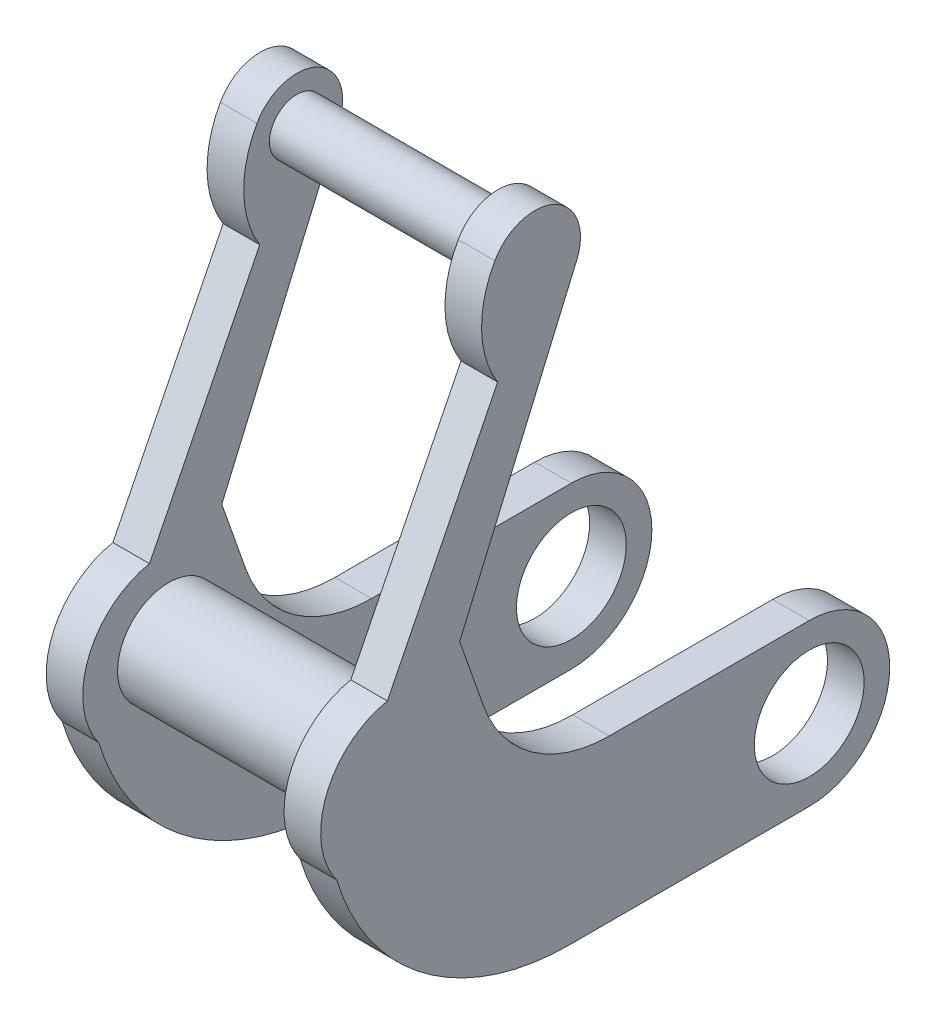
ISO-10303-21;
HEADER;
FILE_DESCRIPTION(('STEP AP214'),'2;1');
FILE_NAME('part.step','',(''),(''),'','','');
FILE_SCHEMA(('AUTOMOTIVE_DESIGN { 1 0 10303 214 1 1 1 1 }'));
ENDSEC;
DATA;
#1=APPLICATION_CONTEXT('core data for automotive mechanical design processes');
#2=APPLICATION_PROTOCOL_DEFINITION('international standard','automotive_design',2000,#1);
#3=PRODUCT_CONTEXT('',#1,'mechanical');
#4=PRODUCT('Part','Part','',(#3));
#5=PRODUCT_RELATED_PRODUCT_CATEGORY('part','',(#4));
#6=PRODUCT_DEFINITION_FORMATION('','',#4);
#7=PRODUCT_DEFINITION_CONTEXT('part definition',#1,'design');
#8=PRODUCT_DEFINITION('design','',#6,#7);
#9=PRODUCT_DEFINITION_SHAPE('','',#8);
#10=(LENGTH_UNIT() NAMED_UNIT(*) SI_UNIT(.MILLI.,.METRE.));
#11=(NAMED_UNIT(*) PLANE_ANGLE_UNIT() SI_UNIT($,.RADIAN.));
#12=(NAMED_UNIT(*) SI_UNIT($,.STERADIAN.) SOLID_ANGLE_UNIT());
#13=UNCERTAINTY_MEASURE_WITH_UNIT(LENGTH_MEASURE(1.E-05),#10,'distance_accuracy_value','');
#14=(GEOMETRIC_REPRESENTATION_CONTEXT(3) GLOBAL_UNCERTAINTY_ASSIGNED_CONTEXT((#13)) GLOBAL_UNIT_ASSIGNED_CONTEXT((#10,
#11,#12)) REPRESENTATION_CONTEXT('',''));
#15=CARTESIAN_POINT('',(0.,0.,0.));
#16=DIRECTION('',(0.,0.,1.));
#17=DIRECTION('',(1.,0.,0.));
#18=AXIS2_PLACEMENT_3D('',#15,#16,#17);
#19=CARTESIAN_POINT('',(20.,0.,0.));
#20=DIRECTION('',(1.,0.,0.));
#21=DIRECTION('',(0.,0.,-1.));
#22=AXIS2_PLACEMENT_3D('',#19,#20,#21);
#23=PLANE('',#22);
#24=CARTESIAN_POINT('',(20.,0.,0.));
#25=DIRECTION('',(1.,0.,0.));
#26=DIRECTION('',(0.,0.,-1.));
#27=AXIS2_PLACEMENT_3D('',#24,#25,#26);
#28=CIRCLE('',#27,44.);
#29=CARTESIAN_POINT('',(20.,-44.,0.));
#30=VERTEX_POINT('',#29);
#31=CARTESIAN_POINT('',(20.,44.,0.));
#32=VERTEX_POINT('',#31);
#33=EDGE_CURVE('E173',#30,#32,#28,.T.);
#34=ORIENTED_EDGE('',*,*,#33,.T.);
#35=DIRECTION('',(0.,0.,1.));
#36=VECTOR('',#35,1.);
#37=CARTESIAN_POINT('',(20.,44.,0.));
#38=LINE('',#37,#36);
#39=CARTESIAN_POINT('',(20.,44.,109.215135043859));
#40=VERTEX_POINT('',#39);
#41=EDGE_CURVE('E103',#32,#40,#38,.T.);
#42=ORIENTED_EDGE('',*,*,#41,.T.);
#43=CARTESIAN_POINT('',(20.,117.,109.215135043859));
#44=DIRECTION('',(-1.,0.,0.));
#45=DIRECTION('',(0.,0.,-1.));
#46=AXIS2_PLACEMENT_3D('',#43,#44,#45);
#47=CIRCLE('',#46,73.0000000000001);
#48=CARTESIAN_POINT('',(20.,92.7522373724899,178.070389074034));
#49=VERTEX_POINT('',#48);
#50=EDGE_CURVE('E333',#40,#49,#47,.T.);
#51=ORIENTED_EDGE('',*,*,#50,.T.);
#52=DIRECTION('',(0.,0.943222657947602,0.332161131883701));
#53=VECTOR('',#52,1.);
#54=CARTESIAN_POINT('',(20.,92.7522373724899,178.070389074034));
#55=LINE('',#54,#53);
#56=CARTESIAN_POINT('',(20.,129.537921032446,191.024673217498));
#57=VERTEX_POINT('',#56);
#58=EDGE_CURVE('E335',#49,#57,#55,.T.);
#59=ORIENTED_EDGE('',*,*,#58,.T.);
#60=DIRECTION('',(0.,0.918446381343086,-0.395545502562969));
#61=VECTOR('',#60,1.);
#62=CARTESIAN_POINT('',(20.,129.537921032446,191.024673217498));
#63=LINE('',#62,#61);
#64=CARTESIAN_POINT('',(20.,278.111362435926,127.038840466423));
#65=VERTEX_POINT('',#64);
#66=EDGE_CURVE('E337',#57,#65,#63,.T.);
#67=ORIENTED_EDGE('',*,*,#66,.T.);
#68=CARTESIAN_POINT('',(20.,288.,150.));
#69=DIRECTION('',(1.,0.,0.));
#70=DIRECTION('',(0.,0.,-1.));
#71=AXIS2_PLACEMENT_3D('',#68,#69,#70);
#72=CIRCLE('',#71,24.9999999999999);
#73=CARTESIAN_POINT('',(20.,300.199413834294,171.821418425474));
#74=VERTEX_POINT('',#73);
#75=EDGE_CURVE('E339',#65,#74,#72,.T.);
#76=ORIENTED_EDGE('',*,*,#75,.T.);
#77=CARTESIAN_POINT('',(20.,272.384750292103,122.068584415393));
#78=DIRECTION('',(1.,0.,0.));
#79=DIRECTION('',(0.,0.,-1.));
#80=AXIS2_PLACEMENT_3D('',#77,#78,#79);
#81=CIRCLE('',#80,57.);
#82=CARTESIAN_POINT('',(20.,242.,170.294790462381));
#83=VERTEX_POINT('',#82);
#84=EDGE_CURVE('E341',#74,#83,#81,.T.);
#85=ORIENTED_EDGE('',*,*,#84,.T.);
#86=DIRECTION('',(0.,-0.894934361602023,0.446197813109813));
#87=VECTOR('',#86,1.);
#88=CARTESIAN_POINT('',(20.,121.183861183727,230.531495232206));
#89=LINE('',#88,#87);
#90=CARTESIAN_POINT('',(20.,121.183861183727,230.531495232206));
#91=VERTEX_POINT('',#90);
#92=EDGE_CURVE('E134',#83,#91,#89,.T.);
#93=ORIENTED_EDGE('',*,*,#92,.T.);
#94=CARTESIAN_POINT('',(20.,77.,222.));
#95=DIRECTION('',(1.,0.,0.));
#96=DIRECTION('',(0.,0.,-1.));
#97=AXIS2_PLACEMENT_3D('',#94,#95,#96);
#98=CIRCLE('',#97,45.);
#99=CARTESIAN_POINT('',(20.,50.3509597877907,258.260566125863));
#100=VERTEX_POINT('',#99);
#101=EDGE_CURVE('E128',#91,#100,#98,.T.);
#102=ORIENTED_EDGE('',*,*,#101,.T.);
#103=CARTESIAN_POINT('',(20.,89.,131.));
#104=DIRECTION('',(1.,0.,0.));
#105=DIRECTION('',(0.,0.,-1.));
#106=AXIS2_PLACEMENT_3D('',#103,#104,#105);
#107=CIRCLE('',#106,133.);
#108=CARTESIAN_POINT('',(20.,-44.,131.));
#109=VERTEX_POINT('',#108);
#110=EDGE_CURVE('E132',#100,#109,#107,.T.);
#111=ORIENTED_EDGE('',*,*,#110,.T.);
#112=DIRECTION('',(0.,0.,-1.));
#113=VECTOR('',#112,1.);
#114=CARTESIAN_POINT('',(20.,-44.,0.));
#115=LINE('',#114,#113);
#116=EDGE_CURVE('E49',#109,#30,#115,.T.);
#117=ORIENTED_EDGE('',*,*,#116,.T.);
#118=EDGE_LOOP('',(#34,#42,#51,#59,#67,#76,#85,#93,#102,#111,#117));
#119=FACE_BOUND('',#118,.T.);
#120=CARTESIAN_POINT('',(20.,0.,0.));
#121=DIRECTION('',(1.,0.,0.));
#122=DIRECTION('',(0.,0.,-1.));
#123=AXIS2_PLACEMENT_3D('',#120,#121,#122);
#124=CIRCLE('',#123,30.);
#125=CARTESIAN_POINT('',(20.,0.,-30.));
#126=VERTEX_POINT('',#125);
#127=EDGE_CURVE('E156',#126,#126,#124,.T.);
#128=ORIENTED_EDGE('',*,*,#127,.F.);
#129=EDGE_LOOP('',(#128));
#130=FACE_BOUND('',#129,.T.);
#131=ADVANCED_FACE('F32',(#119,#130),#23,.T.);
#132=CARTESIAN_POINT('',(0.,0.,0.));
#133=DIRECTION('',(1.,0.,0.));
#134=DIRECTION('',(0.,0.,-1.));
#135=AXIS2_PLACEMENT_3D('',#132,#133,#134);
#136=PLANE('',#135);
#137=CARTESIAN_POINT('',(0.,79.,220.));
#138=DIRECTION('',(1.,0.,0.));
#139=DIRECTION('',(0.,0.,-1.));
#140=AXIS2_PLACEMENT_3D('',#137,#138,#139);
#141=CIRCLE('',#140,28.);
#142=CARTESIAN_POINT('',(0.,79.,192.));
#143=VERTEX_POINT('',#142);
#144=EDGE_CURVE('E11',#143,#143,#141,.F.);
#145=ORIENTED_EDGE('',*,*,#144,.F.);
#146=EDGE_LOOP('',(#145));
#147=FACE_BOUND('',#146,.T.);
#148=CARTESIAN_POINT('',(0.,288.,150.));
#149=DIRECTION('',(1.,0.,0.));
#150=DIRECTION('',(0.,0.,-1.));
#151=AXIS2_PLACEMENT_3D('',#148,#149,#150);
#152=CIRCLE('',#151,15.);
#153=CARTESIAN_POINT('',(0.,288.,135.));
#154=VERTEX_POINT('',#153);
#155=EDGE_CURVE('E197',#154,#154,#152,.F.);
#156=ORIENTED_EDGE('',*,*,#155,.F.);
#157=EDGE_LOOP('',(#156));
#158=FACE_BOUND('',#157,.T.);
#159=CARTESIAN_POINT('',(0.,0.,0.));
#160=DIRECTION('',(1.,0.,0.));
#161=DIRECTION('',(0.,0.,-1.));
#162=AXIS2_PLACEMENT_3D('',#159,#160,#161);
#163=CIRCLE('',#162,44.);
#164=CARTESIAN_POINT('',(0.,-44.,0.));
#165=VERTEX_POINT('',#164);
#166=CARTESIAN_POINT('',(0.,44.,0.));
#167=VERTEX_POINT('',#166);
#168=EDGE_CURVE('E152',#165,#167,#163,.T.);
#169=ORIENTED_EDGE('',*,*,#168,.F.);
#170=DIRECTION('',(0.,0.,-1.));
#171=VECTOR('',#170,1.);
#172=CARTESIAN_POINT('',(0.,-44.,0.));
#173=LINE('',#172,#171);
#174=CARTESIAN_POINT('',(0.,-44.,131.));
#175=VERTEX_POINT('',#174);
#176=EDGE_CURVE('E94',#175,#165,#173,.T.);
#177=ORIENTED_EDGE('',*,*,#176,.F.);
#178=CARTESIAN_POINT('',(0.,89.,131.));
#179=DIRECTION('',(1.,0.,0.));
#180=DIRECTION('',(0.,0.,-1.));
#181=AXIS2_PLACEMENT_3D('',#178,#179,#180);
#182=CIRCLE('',#181,133.);
#183=CARTESIAN_POINT('',(0.,50.3509597877907,258.260566125863));
#184=VERTEX_POINT('',#183);
#185=EDGE_CURVE('E88',#184,#175,#182,.T.);
#186=ORIENTED_EDGE('',*,*,#185,.F.);
#187=CARTESIAN_POINT('',(0.,77.,222.));
#188=DIRECTION('',(1.,0.,0.));
#189=DIRECTION('',(0.,0.,-1.));
#190=AXIS2_PLACEMENT_3D('',#187,#188,#189);
#191=CIRCLE('',#190,45.);
#192=CARTESIAN_POINT('',(0.,121.183861183727,230.531495232206));
#193=VERTEX_POINT('',#192);
#194=EDGE_CURVE('E142',#193,#184,#191,.T.);
#195=ORIENTED_EDGE('',*,*,#194,.F.);
#196=DIRECTION('',(0.,-0.894934361602023,0.446197813109813));
#197=VECTOR('',#196,1.);
#198=CARTESIAN_POINT('',(0.,121.183861183727,230.531495232206));
#199=LINE('',#198,#197);
#200=CARTESIAN_POINT('',(0.,242.,170.294790462381));
#201=VERTEX_POINT('',#200);
#202=EDGE_CURVE('E168',#201,#193,#199,.T.);
#203=ORIENTED_EDGE('',*,*,#202,.F.);
#204=CARTESIAN_POINT('',(0.,272.384750292103,122.068584415393));
#205=DIRECTION('',(1.,0.,0.));
#206=DIRECTION('',(0.,0.,-1.));
#207=AXIS2_PLACEMENT_3D('',#204,#205,#206);
#208=CIRCLE('',#207,57.);
#209=CARTESIAN_POINT('',(0.,300.199413834294,171.821418425474));
#210=VERTEX_POINT('',#209);
#211=EDGE_CURVE('E166',#210,#201,#208,.T.);
#212=ORIENTED_EDGE('',*,*,#211,.F.);
#213=CARTESIAN_POINT('',(0.,288.,150.));
#214=DIRECTION('',(1.,0.,0.));
#215=DIRECTION('',(0.,0.,-1.));
#216=AXIS2_PLACEMENT_3D('',#213,#214,#215);
#217=CIRCLE('',#216,24.9999999999999);
#218=CARTESIAN_POINT('',(0.,278.111362435926,127.038840466423));
#219=VERTEX_POINT('',#218);
#220=EDGE_CURVE('E164',#219,#210,#217,.T.);
#221=ORIENTED_EDGE('',*,*,#220,.F.);
#222=DIRECTION('',(0.,0.918446381343086,-0.395545502562969));
#223=VECTOR('',#222,1.);
#224=CARTESIAN_POINT('',(0.,129.537921032446,191.024673217498));
#225=LINE('',#224,#223);
#226=CARTESIAN_POINT('',(0.,129.537921032446,191.024673217498));
#227=VERTEX_POINT('',#226);
#228=EDGE_CURVE('E162',#227,#219,#225,.T.);
#229=ORIENTED_EDGE('',*,*,#228,.F.);
#230=DIRECTION('',(0.,0.943222657947602,0.332161131883701));
#231=VECTOR('',#230,1.);
#232=CARTESIAN_POINT('',(0.,92.7522373724899,178.070389074034));
#233=LINE('',#232,#231);
#234=CARTESIAN_POINT('',(0.,92.7522373724899,178.070389074034));
#235=VERTEX_POINT('',#234);
#236=EDGE_CURVE('E160',#235,#227,#233,.T.);
#237=ORIENTED_EDGE('',*,*,#236,.F.);
#238=CARTESIAN_POINT('',(0.,117.,109.215135043859));
#239=DIRECTION('',(-1.,0.,0.));
#240=DIRECTION('',(0.,0.,-1.));
#241=AXIS2_PLACEMENT_3D('',#238,#239,#240);
#242=CIRCLE('',#241,73.0000000000001);
#243=CARTESIAN_POINT('',(0.,44.,109.215135043859));
#244=VERTEX_POINT('',#243);
#245=EDGE_CURVE('E158',#244,#235,#242,.T.);
#246=ORIENTED_EDGE('',*,*,#245,.F.);
#247=DIRECTION('',(0.,0.,1.));
#248=VECTOR('',#247,1.);
#249=CARTESIAN_POINT('',(0.,44.,0.));
#250=LINE('',#249,#248);
#251=EDGE_CURVE('E155',#167,#244,#250,.T.);
#252=ORIENTED_EDGE('',*,*,#251,.F.);
#253=EDGE_LOOP('',(#169,#177,#186,#195,#203,#212,#221,#229,#237,#246,#252));
#254=FACE_BOUND('',#253,.T.);
#255=CARTESIAN_POINT('',(0.,0.,0.));
#256=DIRECTION('',(1.,0.,0.));
#257=DIRECTION('',(0.,0.,-1.));
#258=AXIS2_PLACEMENT_3D('',#255,#256,#257);
#259=CIRCLE('',#258,30.);
#260=CARTESIAN_POINT('',(0.,0.,-30.));
#261=VERTEX_POINT('',#260);
#262=EDGE_CURVE('E326',#261,#261,#259,.T.);
#263=ORIENTED_EDGE('',*,*,#262,.T.);
#264=EDGE_LOOP('',(#263));
#265=FACE_BOUND('',#264,.T.);
#266=ADVANCED_FACE('F354',(#147,#158,#254,#265),#136,.F.);
#267=CARTESIAN_POINT('',(20.,0.,0.));
#268=DIRECTION('',(-1.,0.,0.));
#269=DIRECTION('',(0.,0.,1.));
#270=AXIS2_PLACEMENT_3D('',#267,#268,#269);
#271=CYLINDRICAL_SURFACE('',#270,44.);
#272=ORIENTED_EDGE('',*,*,#168,.T.);
#273=DIRECTION('',(-1.,0.,0.));
#274=VECTOR('',#273,1.);
#275=CARTESIAN_POINT('',(20.,44.,0.));
#276=LINE('',#275,#274);
#277=EDGE_CURVE('E195',#32,#167,#276,.T.);
#278=ORIENTED_EDGE('',*,*,#277,.F.);
#279=ORIENTED_EDGE('',*,*,#33,.F.);
#280=DIRECTION('',(-1.,0.,0.));
#281=VECTOR('',#280,1.);
#282=CARTESIAN_POINT('',(20.,-44.,0.));
#283=LINE('',#282,#281);
#284=EDGE_CURVE('E148',#30,#165,#283,.T.);
#285=ORIENTED_EDGE('',*,*,#284,.T.);
#286=EDGE_LOOP('',(#272,#278,#279,#285));
#287=FACE_BOUND('',#286,.T.);
#288=ADVANCED_FACE('F34',(#287),#271,.T.);
#289=CARTESIAN_POINT('',(20.,44.,0.));
#290=DIRECTION('',(0.,-1.,0.));
#291=DIRECTION('',(0.,0.,-1.));
#292=AXIS2_PLACEMENT_3D('',#289,#290,#291);
#293=PLANE('',#292);
#294=ORIENTED_EDGE('',*,*,#251,.T.);
#295=DIRECTION('',(-1.,0.,0.));
#296=VECTOR('',#295,1.);
#297=CARTESIAN_POINT('',(20.,44.,109.215135043859));
#298=LINE('',#297,#296);
#299=EDGE_CURVE('E192',#40,#244,#298,.T.);
#300=ORIENTED_EDGE('',*,*,#299,.F.);
#301=ORIENTED_EDGE('',*,*,#41,.F.);
#302=ORIENTED_EDGE('',*,*,#277,.T.);
#303=EDGE_LOOP('',(#294,#300,#301,#302));
#304=FACE_BOUND('',#303,.T.);
#305=ADVANCED_FACE('F580',(#304),#293,.F.);
#306=CARTESIAN_POINT('',(20.,117.,109.215135043859));
#307=DIRECTION('',(-1.,0.,0.));
#308=DIRECTION('',(0.,0.,1.));
#309=AXIS2_PLACEMENT_3D('',#306,#307,#308);
#310=CYLINDRICAL_SURFACE('',#309,73.0000000000001);
#311=ORIENTED_EDGE('',*,*,#245,.T.);
#312=DIRECTION('',(-1.,0.,0.));
#313=VECTOR('',#312,1.);
#314=CARTESIAN_POINT('',(20.,92.7522373724899,178.070389074034));
#315=LINE('',#314,#313);
#316=EDGE_CURVE('E189',#49,#235,#315,.T.);
#317=ORIENTED_EDGE('',*,*,#316,.F.);
#318=ORIENTED_EDGE('',*,*,#50,.F.);
#319=ORIENTED_EDGE('',*,*,#299,.T.);
#320=EDGE_LOOP('',(#311,#317,#318,#319));
#321=FACE_BOUND('',#320,.T.);
#322=ADVANCED_FACE('F570',(#321),#310,.F.);
#323=CARTESIAN_POINT('',(20.,92.7522373724899,178.070389074034));
#324=DIRECTION('',(0.,-0.332161131883701,0.943222657947602));
#325=DIRECTION('',(0.,-0.943222657947602,-0.332161131883701));
#326=AXIS2_PLACEMENT_3D('',#323,#324,#325);
#327=PLANE('',#326);
#328=ORIENTED_EDGE('',*,*,#236,.T.);
#329=DIRECTION('',(-1.,0.,0.));
#330=VECTOR('',#329,1.);
#331=CARTESIAN_POINT('',(20.,129.537921032446,191.024673217498));
#332=LINE('',#331,#330);
#333=EDGE_CURVE('E186',#57,#227,#332,.T.);
#334=ORIENTED_EDGE('',*,*,#333,.F.);
#335=ORIENTED_EDGE('',*,*,#58,.F.);
#336=ORIENTED_EDGE('',*,*,#316,.T.);
#337=EDGE_LOOP('',(#328,#334,#335,#336));
#338=FACE_BOUND('',#337,.T.);
#339=ADVANCED_FACE('F560',(#338),#327,.F.);
#340=CARTESIAN_POINT('',(20.,129.537921032446,191.024673217498));
#341=DIRECTION('',(0.,0.395545502562969,0.918446381343086));
#342=DIRECTION('',(0.,-0.918446381343086,0.395545502562969));
#343=AXIS2_PLACEMENT_3D('',#340,#341,#342);
#344=PLANE('',#343);
#345=ORIENTED_EDGE('',*,*,#228,.T.);
#346=DIRECTION('',(-1.,0.,0.));
#347=VECTOR('',#346,1.);
#348=CARTESIAN_POINT('',(20.,278.111362435926,127.038840466423));
#349=LINE('',#348,#347);
#350=EDGE_CURVE('E183',#65,#219,#349,.T.);
#351=ORIENTED_EDGE('',*,*,#350,.F.);
#352=ORIENTED_EDGE('',*,*,#66,.F.);
#353=ORIENTED_EDGE('',*,*,#333,.T.);
#354=EDGE_LOOP('',(#345,#351,#352,#353));
#355=FACE_BOUND('',#354,.T.);
#356=ADVANCED_FACE('F550',(#355),#344,.F.);
#357=CARTESIAN_POINT('',(20.,288.,150.));
#358=DIRECTION('',(-1.,0.,0.));
#359=DIRECTION('',(0.,0.,1.));
#360=AXIS2_PLACEMENT_3D('',#357,#358,#359);
#361=CYLINDRICAL_SURFACE('',#360,24.9999999999999);
#362=ORIENTED_EDGE('',*,*,#220,.T.);
#363=DIRECTION('',(-1.,0.,0.));
#364=VECTOR('',#363,1.);
#365=CARTESIAN_POINT('',(20.,300.199413834294,171.821418425474));
#366=LINE('',#365,#364);
#367=EDGE_CURVE('E180',#74,#210,#366,.T.);
#368=ORIENTED_EDGE('',*,*,#367,.F.);
#369=ORIENTED_EDGE('',*,*,#75,.F.);
#370=ORIENTED_EDGE('',*,*,#350,.T.);
#371=EDGE_LOOP('',(#362,#368,#369,#370));
#372=FACE_BOUND('',#371,.T.);
#373=ADVANCED_FACE('F541',(#372),#361,.T.);
#374=CARTESIAN_POINT('',(20.,272.384750292103,122.068584415393));
#375=DIRECTION('',(-1.,0.,0.));
#376=DIRECTION('',(0.,0.,1.));
#377=AXIS2_PLACEMENT_3D('',#374,#375,#376);
#378=CYLINDRICAL_SURFACE('',#377,57.);
#379=ORIENTED_EDGE('',*,*,#211,.T.);
#380=DIRECTION('',(-1.,0.,0.));
#381=VECTOR('',#380,1.);
#382=CARTESIAN_POINT('',(20.,242.,170.294790462381));
#383=LINE('',#382,#381);
#384=EDGE_CURVE('E177',#83,#201,#383,.T.);
#385=ORIENTED_EDGE('',*,*,#384,.F.);
#386=ORIENTED_EDGE('',*,*,#84,.F.);
#387=ORIENTED_EDGE('',*,*,#367,.T.);
#388=EDGE_LOOP('',(#379,#385,#386,#387));
#389=FACE_BOUND('',#388,.T.);
#390=ADVANCED_FACE('F347',(#389),#378,.T.);
#391=CARTESIAN_POINT('',(20.,121.183861183727,230.531495232206));
#392=DIRECTION('',(0.,-0.446197813109813,-0.894934361602023));
#393=DIRECTION('',(0.,0.894934361602023,-0.446197813109813));
#394=AXIS2_PLACEMENT_3D('',#391,#392,#393);
#395=PLANE('',#394);
#396=ORIENTED_EDGE('',*,*,#202,.T.);
#397=DIRECTION('',(-1.,0.,0.));
#398=VECTOR('',#397,1.);
#399=CARTESIAN_POINT('',(20.,121.183861183727,230.531495232206));
#400=LINE('',#399,#398);
#401=EDGE_CURVE('E143',#91,#193,#400,.T.);
#402=ORIENTED_EDGE('',*,*,#401,.F.);
#403=ORIENTED_EDGE('',*,*,#92,.F.);
#404=ORIENTED_EDGE('',*,*,#384,.T.);
#405=EDGE_LOOP('',(#396,#402,#403,#404));
#406=FACE_BOUND('',#405,.T.);
#407=ADVANCED_FACE('F351',(#406),#395,.F.);
#408=CARTESIAN_POINT('',(20.,77.,222.));
#409=DIRECTION('',(-1.,0.,0.));
#410=DIRECTION('',(0.,0.,1.));
#411=AXIS2_PLACEMENT_3D('',#408,#409,#410);
#412=CYLINDRICAL_SURFACE('',#411,45.);
#413=ORIENTED_EDGE('',*,*,#194,.T.);
#414=DIRECTION('',(-1.,0.,0.));
#415=VECTOR('',#414,1.);
#416=CARTESIAN_POINT('',(20.,50.3509597877907,258.260566125863));
#417=LINE('',#416,#415);
#418=EDGE_CURVE('E139',#100,#184,#417,.T.);
#419=ORIENTED_EDGE('',*,*,#418,.F.);
#420=ORIENTED_EDGE('',*,*,#101,.F.);
#421=ORIENTED_EDGE('',*,*,#401,.T.);
#422=EDGE_LOOP('',(#413,#419,#420,#421));
#423=FACE_BOUND('',#422,.T.);
#424=ADVANCED_FACE('F140',(#423),#412,.T.);
#425=CARTESIAN_POINT('',(20.,89.,131.));
#426=DIRECTION('',(-1.,0.,0.));
#427=DIRECTION('',(0.,0.,1.));
#428=AXIS2_PLACEMENT_3D('',#425,#426,#427);
#429=CYLINDRICAL_SURFACE('',#428,133.);
#430=ORIENTED_EDGE('',*,*,#185,.T.);
#431=DIRECTION('',(-1.,0.,0.));
#432=VECTOR('',#431,1.);
#433=CARTESIAN_POINT('',(20.,-44.,131.));
#434=LINE('',#433,#432);
#435=EDGE_CURVE('E144',#109,#175,#434,.T.);
#436=ORIENTED_EDGE('',*,*,#435,.F.);
#437=ORIENTED_EDGE('',*,*,#110,.F.);
#438=ORIENTED_EDGE('',*,*,#418,.T.);
#439=EDGE_LOOP('',(#430,#436,#437,#438));
#440=FACE_BOUND('',#439,.T.);
#441=ADVANCED_FACE('F146',(#440),#429,.T.);
#442=CARTESIAN_POINT('',(20.,-44.,0.));
#443=DIRECTION('',(0.,1.,0.));
#444=DIRECTION('',(0.,0.,1.));
#445=AXIS2_PLACEMENT_3D('',#442,#443,#444);
#446=PLANE('',#445);
#447=ORIENTED_EDGE('',*,*,#176,.T.);
#448=ORIENTED_EDGE('',*,*,#284,.F.);
#449=ORIENTED_EDGE('',*,*,#116,.F.);
#450=ORIENTED_EDGE('',*,*,#435,.T.);
#451=EDGE_LOOP('',(#447,#448,#449,#450));
#452=FACE_BOUND('',#451,.T.);
#453=ADVANCED_FACE('F360',(#452),#446,.F.);
#454=CARTESIAN_POINT('',(20.,0.,0.));
#455=DIRECTION('',(-1.,0.,0.));
#456=DIRECTION('',(0.,0.,1.));
#457=AXIS2_PLACEMENT_3D('',#454,#455,#456);
#458=CYLINDRICAL_SURFACE('',#457,30.);
#459=ORIENTED_EDGE('',*,*,#127,.T.);
#460=EDGE_LOOP('',(#459));
#461=FACE_BOUND('',#460,.T.);
#462=ORIENTED_EDGE('',*,*,#262,.F.);
#463=EDGE_LOOP('',(#462));
#464=FACE_BOUND('',#463,.T.);
#465=ADVANCED_FACE('F362',(#461,#464),#458,.F.);
#466=CARTESIAN_POINT('',(0.,288.,150.));
#467=DIRECTION('',(-1.,0.,0.));
#468=DIRECTION('',(0.,0.,1.));
#469=AXIS2_PLACEMENT_3D('',#466,#467,#468);
#470=CYLINDRICAL_SURFACE('',#469,15.);
#471=ORIENTED_EDGE('',*,*,#155,.T.);
#472=EDGE_LOOP('',(#471));
#473=FACE_BOUND('',#472,.T.);
#474=CARTESIAN_POINT('',(-110.,288.,150.));
#475=DIRECTION('',(-1.,0.,0.));
#476=DIRECTION('',(0.,0.,1.));
#477=AXIS2_PLACEMENT_3D('',#474,#475,#476);
#478=CIRCLE('',#477,15.);
#479=CARTESIAN_POINT('',(-110.,288.,165.));
#480=VERTEX_POINT('',#479);
#481=EDGE_CURVE('E213',#480,#480,#478,.T.);
#482=ORIENTED_EDGE('',*,*,#481,.F.);
#483=EDGE_LOOP('',(#482));
#484=FACE_BOUND('',#483,.T.);
#485=ADVANCED_FACE('F368',(#473,#484),#470,.T.);
#486=CARTESIAN_POINT('',(-130.,0.,0.));
#487=DIRECTION('',(-1.,0.,0.));
#488=DIRECTION('',(0.,0.,-1.));
#489=AXIS2_PLACEMENT_3D('',#486,#487,#488);
#490=PLANE('',#489);
#491=CARTESIAN_POINT('',(-130.,0.,0.));
#492=DIRECTION('',(1.,0.,0.));
#493=DIRECTION('',(0.,0.,-1.));
#494=AXIS2_PLACEMENT_3D('',#491,#492,#493);
#495=CIRCLE('',#494,44.);
#496=CARTESIAN_POINT('',(-130.,-44.,0.));
#497=VERTEX_POINT('',#496);
#498=CARTESIAN_POINT('',(-130.,44.,0.));
#499=VERTEX_POINT('',#498);
#500=EDGE_CURVE('E230',#497,#499,#495,.T.);
#501=ORIENTED_EDGE('',*,*,#500,.F.);
#502=DIRECTION('',(0.,0.,-1.));
#503=VECTOR('',#502,1.);
#504=CARTESIAN_POINT('',(-130.,-44.,0.));
#505=LINE('',#504,#503);
#506=CARTESIAN_POINT('',(-130.,-44.,131.));
#507=VERTEX_POINT('',#506);
#508=EDGE_CURVE('E261',#507,#497,#505,.T.);
#509=ORIENTED_EDGE('',*,*,#508,.F.);
#510=CARTESIAN_POINT('',(-130.,89.,131.));
#511=DIRECTION('',(1.,0.,0.));
#512=DIRECTION('',(0.,0.,-1.));
#513=AXIS2_PLACEMENT_3D('',#510,#511,#512);
#514=CIRCLE('',#513,133.);
#515=CARTESIAN_POINT('',(-130.,50.3509597877907,258.260566125863));
#516=VERTEX_POINT('',#515);
#517=EDGE_CURVE('E258',#516,#507,#514,.T.);
#518=ORIENTED_EDGE('',*,*,#517,.F.);
#519=CARTESIAN_POINT('',(-130.,77.,222.));
#520=DIRECTION('',(1.,0.,0.));
#521=DIRECTION('',(0.,0.,-1.));
#522=AXIS2_PLACEMENT_3D('',#519,#520,#521);
#523=CIRCLE('',#522,45.);
#524=CARTESIAN_POINT('',(-130.,121.183861183727,230.531495232206));
#525=VERTEX_POINT('',#524);
#526=EDGE_CURVE('E255',#525,#516,#523,.T.);
#527=ORIENTED_EDGE('',*,*,#526,.F.);
#528=DIRECTION('',(0.,-0.894934361602023,0.446197813109813));
#529=VECTOR('',#528,1.);
#530=CARTESIAN_POINT('',(-130.,121.183861183727,230.531495232206));
#531=LINE('',#530,#529);
#532=CARTESIAN_POINT('',(-130.,242.,170.294790462381));
#533=VERTEX_POINT('',#532);
#534=EDGE_CURVE('E252',#533,#525,#531,.T.);
#535=ORIENTED_EDGE('',*,*,#534,.F.);
#536=CARTESIAN_POINT('',(-130.,272.384750292103,122.068584415393));
#537=DIRECTION('',(1.,0.,0.));
#538=DIRECTION('',(0.,0.,-1.));
#539=AXIS2_PLACEMENT_3D('',#536,#537,#538);
#540=CIRCLE('',#539,57.);
#541=CARTESIAN_POINT('',(-130.,300.199413834294,171.821418425474));
#542=VERTEX_POINT('',#541);
#543=EDGE_CURVE('E249',#542,#533,#540,.T.);
#544=ORIENTED_EDGE('',*,*,#543,.F.);
#545=CARTESIAN_POINT('',(-130.,288.,150.));
#546=DIRECTION('',(1.,0.,0.));
#547=DIRECTION('',(0.,0.,-1.));
#548=AXIS2_PLACEMENT_3D('',#545,#546,#547);
#549=CIRCLE('',#548,24.9999999999999);
#550=CARTESIAN_POINT('',(-130.,278.111362435926,127.038840466423));
#551=VERTEX_POINT('',#550);
#552=EDGE_CURVE('E246',#551,#542,#549,.T.);
#553=ORIENTED_EDGE('',*,*,#552,.F.);
#554=DIRECTION('',(0.,0.918446381343086,-0.395545502562969));
#555=VECTOR('',#554,1.);
#556=CARTESIAN_POINT('',(-130.,129.537921032446,191.024673217498));
#557=LINE('',#556,#555);
#558=CARTESIAN_POINT('',(-130.,129.537921032446,191.024673217498));
#559=VERTEX_POINT('',#558);
#560=EDGE_CURVE('E243',#559,#551,#557,.T.);
#561=ORIENTED_EDGE('',*,*,#560,.F.);
#562=DIRECTION('',(0.,0.943222657947602,0.332161131883701));
#563=VECTOR('',#562,1.);
#564=CARTESIAN_POINT('',(-130.,92.7522373724899,178.070389074034));
#565=LINE('',#564,#563);
#566=CARTESIAN_POINT('',(-130.,92.7522373724899,178.070389074034));
#567=VERTEX_POINT('',#566);
#568=EDGE_CURVE('E240',#567,#559,#565,.T.);
#569=ORIENTED_EDGE('',*,*,#568,.F.);
#570=CARTESIAN_POINT('',(-130.,117.,109.215135043859));
#571=DIRECTION('',(-1.,0.,0.));
#572=DIRECTION('',(0.,0.,-1.));
#573=AXIS2_PLACEMENT_3D('',#570,#571,#572);
#574=CIRCLE('',#573,73.0000000000001);
#575=CARTESIAN_POINT('',(-130.,44.,109.215135043859));
#576=VERTEX_POINT('',#575);
#577=EDGE_CURVE('E237',#576,#567,#574,.T.);
#578=ORIENTED_EDGE('',*,*,#577,.F.);
#579=DIRECTION('',(0.,0.,1.));
#580=VECTOR('',#579,1.);
#581=CARTESIAN_POINT('',(-130.,44.,0.));
#582=LINE('',#581,#580);
#583=EDGE_CURVE('E233',#499,#576,#582,.T.);
#584=ORIENTED_EDGE('',*,*,#583,.F.);
#585=EDGE_LOOP('',(#501,#509,#518,#527,#535,#544,#553,#561,#569,#578,#584));
#586=FACE_BOUND('',#585,.T.);
#587=CARTESIAN_POINT('',(-130.,0.,0.));
#588=DIRECTION('',(1.,0.,0.));
#589=DIRECTION('',(0.,0.,-1.));
#590=AXIS2_PLACEMENT_3D('',#587,#588,#589);
#591=CIRCLE('',#590,30.);
#592=CARTESIAN_POINT('',(-130.,0.,-30.));
#593=VERTEX_POINT('',#592);
#594=EDGE_CURVE('E225',#593,#593,#591,.T.);
#595=ORIENTED_EDGE('',*,*,#594,.T.);
#596=EDGE_LOOP('',(#595));
#597=FACE_BOUND('',#596,.T.);
#598=ADVANCED_FACE('F208',(#586,#597),#490,.T.);
#599=CARTESIAN_POINT('',(-110.,0.,0.));
#600=DIRECTION('',(-1.,0.,0.));
#601=DIRECTION('',(0.,0.,-1.));
#602=AXIS2_PLACEMENT_3D('',#599,#600,#601);
#603=PLANE('',#602);
#604=CARTESIAN_POINT('',(-110.,79.,220.));
#605=DIRECTION('',(-1.,0.,0.));
#606=DIRECTION('',(0.,0.,1.));
#607=AXIS2_PLACEMENT_3D('',#604,#605,#606);
#608=CIRCLE('',#607,28.);
#609=CARTESIAN_POINT('',(-110.,79.,248.));
#610=VERTEX_POINT('',#609);
#611=EDGE_CURVE('E41',#610,#610,#608,.F.);
#612=ORIENTED_EDGE('',*,*,#611,.F.);
#613=EDGE_LOOP('',(#612));
#614=FACE_BOUND('',#613,.T.);
#615=ORIENTED_EDGE('',*,*,#481,.T.);
#616=EDGE_LOOP('',(#615));
#617=FACE_BOUND('',#616,.T.);
#618=CARTESIAN_POINT('',(-110.,0.,0.));
#619=DIRECTION('',(1.,0.,0.));
#620=DIRECTION('',(0.,0.,-1.));
#621=AXIS2_PLACEMENT_3D('',#618,#619,#620);
#622=CIRCLE('',#621,44.);
#623=CARTESIAN_POINT('',(-110.,-44.,0.));
#624=VERTEX_POINT('',#623);
#625=CARTESIAN_POINT('',(-110.,44.,0.));
#626=VERTEX_POINT('',#625);
#627=EDGE_CURVE('E220',#624,#626,#622,.T.);
#628=ORIENTED_EDGE('',*,*,#627,.T.);
#629=DIRECTION('',(0.,0.,1.));
#630=VECTOR('',#629,1.);
#631=CARTESIAN_POINT('',(-110.,44.,0.));
#632=LINE('',#631,#630);
#633=CARTESIAN_POINT('',(-110.,44.,109.215135043859));
#634=VERTEX_POINT('',#633);
#635=EDGE_CURVE('E266',#626,#634,#632,.T.);
#636=ORIENTED_EDGE('',*,*,#635,.T.);
#637=CARTESIAN_POINT('',(-110.,117.,109.215135043859));
#638=DIRECTION('',(-1.,0.,0.));
#639=DIRECTION('',(0.,0.,-1.));
#640=AXIS2_PLACEMENT_3D('',#637,#638,#639);
#641=CIRCLE('',#640,73.0000000000001);
#642=CARTESIAN_POINT('',(-110.,92.7522373724899,178.070389074034));
#643=VERTEX_POINT('',#642);
#644=EDGE_CURVE('E268',#634,#643,#641,.T.);
#645=ORIENTED_EDGE('',*,*,#644,.T.);
#646=DIRECTION('',(0.,0.943222657947602,0.332161131883701));
#647=VECTOR('',#646,1.);
#648=CARTESIAN_POINT('',(-110.,92.7522373724899,178.070389074034));
#649=LINE('',#648,#647);
#650=CARTESIAN_POINT('',(-110.,129.537921032446,191.024673217498));
#651=VERTEX_POINT('',#650);
#652=EDGE_CURVE('E271',#643,#651,#649,.T.);
#653=ORIENTED_EDGE('',*,*,#652,.T.);
#654=DIRECTION('',(0.,0.918446381343086,-0.395545502562969));
#655=VECTOR('',#654,1.);
#656=CARTESIAN_POINT('',(-110.,129.537921032446,191.024673217498));
#657=LINE('',#656,#655);
#658=CARTESIAN_POINT('',(-110.,278.111362435926,127.038840466423));
#659=VERTEX_POINT('',#658);
#660=EDGE_CURVE('E274',#651,#659,#657,.T.);
#661=ORIENTED_EDGE('',*,*,#660,.T.);
#662=CARTESIAN_POINT('',(-110.,288.,150.));
#663=DIRECTION('',(1.,0.,0.));
#664=DIRECTION('',(0.,0.,-1.));
#665=AXIS2_PLACEMENT_3D('',#662,#663,#664);
#666=CIRCLE('',#665,24.9999999999999);
#667=CARTESIAN_POINT('',(-110.,300.199413834294,171.821418425474));
#668=VERTEX_POINT('',#667);
#669=EDGE_CURVE('E277',#659,#668,#666,.T.);
#670=ORIENTED_EDGE('',*,*,#669,.T.);
#671=CARTESIAN_POINT('',(-110.,272.384750292103,122.068584415393));
#672=DIRECTION('',(1.,0.,0.));
#673=DIRECTION('',(0.,0.,-1.));
#674=AXIS2_PLACEMENT_3D('',#671,#672,#673);
#675=CIRCLE('',#674,57.);
#676=CARTESIAN_POINT('',(-110.,242.,170.294790462381));
#677=VERTEX_POINT('',#676);
#678=EDGE_CURVE('E280',#668,#677,#675,.T.);
#679=ORIENTED_EDGE('',*,*,#678,.T.);
#680=DIRECTION('',(0.,-0.894934361602023,0.446197813109813));
#681=VECTOR('',#680,1.);
#682=CARTESIAN_POINT('',(-110.,121.183861183727,230.531495232206));
#683=LINE('',#682,#681);
#684=CARTESIAN_POINT('',(-110.,121.183861183727,230.531495232206));
#685=VERTEX_POINT('',#684);
#686=EDGE_CURVE('E283',#677,#685,#683,.T.);
#687=ORIENTED_EDGE('',*,*,#686,.T.);
#688=CARTESIAN_POINT('',(-110.,77.,222.));
#689=DIRECTION('',(1.,0.,0.));
#690=DIRECTION('',(0.,0.,-1.));
#691=AXIS2_PLACEMENT_3D('',#688,#689,#690);
#692=CIRCLE('',#691,45.);
#693=CARTESIAN_POINT('',(-110.,50.3509597877907,258.260566125863));
#694=VERTEX_POINT('',#693);
#695=EDGE_CURVE('E286',#685,#694,#692,.T.);
#696=ORIENTED_EDGE('',*,*,#695,.T.);
#697=CARTESIAN_POINT('',(-110.,89.,131.));
#698=DIRECTION('',(1.,0.,0.));
#699=DIRECTION('',(0.,0.,-1.));
#700=AXIS2_PLACEMENT_3D('',#697,#698,#699);
#701=CIRCLE('',#700,133.);
#702=CARTESIAN_POINT('',(-110.,-44.,131.));
#703=VERTEX_POINT('',#702);
#704=EDGE_CURVE('E289',#694,#703,#701,.T.);
#705=ORIENTED_EDGE('',*,*,#704,.T.);
#706=DIRECTION('',(0.,0.,-1.));
#707=VECTOR('',#706,1.);
#708=CARTESIAN_POINT('',(-110.,-44.,0.));
#709=LINE('',#708,#707);
#710=EDGE_CURVE('E234',#703,#624,#709,.T.);
#711=ORIENTED_EDGE('',*,*,#710,.T.);
#712=EDGE_LOOP('',(#628,#636,#645,#653,#661,#670,#679,#687,#696,#705,#711));
#713=FACE_BOUND('',#712,.T.);
#714=CARTESIAN_POINT('',(-110.,0.,0.));
#715=DIRECTION('',(1.,0.,0.));
#716=DIRECTION('',(0.,0.,-1.));
#717=AXIS2_PLACEMENT_3D('',#714,#715,#716);
#718=CIRCLE('',#717,30.);
#719=CARTESIAN_POINT('',(-110.,0.,-30.));
#720=VERTEX_POINT('',#719);
#721=EDGE_CURVE('E223',#720,#720,#718,.T.);
#722=ORIENTED_EDGE('',*,*,#721,.F.);
#723=EDGE_LOOP('',(#722));
#724=FACE_BOUND('',#723,.T.);
#725=ADVANCED_FACE('F204',(#614,#617,#713,#724),#603,.F.);
#726=CARTESIAN_POINT('',(-130.,0.,0.));
#727=DIRECTION('',(1.,0.,0.));
#728=DIRECTION('',(0.,0.,1.));
#729=AXIS2_PLACEMENT_3D('',#726,#727,#728);
#730=CYLINDRICAL_SURFACE('',#729,44.);
#731=ORIENTED_EDGE('',*,*,#627,.F.);
#732=DIRECTION('',(1.,0.,0.));
#733=VECTOR('',#732,1.);
#734=CARTESIAN_POINT('',(-130.,-44.,0.));
#735=LINE('',#734,#733);
#736=EDGE_CURVE('E264',#497,#624,#735,.T.);
#737=ORIENTED_EDGE('',*,*,#736,.F.);
#738=ORIENTED_EDGE('',*,*,#500,.T.);
#739=DIRECTION('',(1.,0.,0.));
#740=VECTOR('',#739,1.);
#741=CARTESIAN_POINT('',(-130.,44.,0.));
#742=LINE('',#741,#740);
#743=EDGE_CURVE('E322',#499,#626,#742,.T.);
#744=ORIENTED_EDGE('',*,*,#743,.T.);
#745=EDGE_LOOP('',(#731,#737,#738,#744));
#746=FACE_BOUND('',#745,.T.);
#747=ADVANCED_FACE('F207',(#746),#730,.T.);
#748=CARTESIAN_POINT('',(-130.,44.,0.));
#749=DIRECTION('',(0.,-1.,0.));
#750=DIRECTION('',(0.,0.,-1.));
#751=AXIS2_PLACEMENT_3D('',#748,#749,#750);
#752=PLANE('',#751);
#753=ORIENTED_EDGE('',*,*,#635,.F.);
#754=ORIENTED_EDGE('',*,*,#743,.F.);
#755=ORIENTED_EDGE('',*,*,#583,.T.);
#756=DIRECTION('',(1.,0.,0.));
#757=VECTOR('',#756,1.);
#758=CARTESIAN_POINT('',(-130.,44.,109.215135043859));
#759=LINE('',#758,#757);
#760=EDGE_CURVE('E319',#576,#634,#759,.T.);
#761=ORIENTED_EDGE('',*,*,#760,.T.);
#762=EDGE_LOOP('',(#753,#754,#755,#761));
#763=FACE_BOUND('',#762,.T.);
#764=ADVANCED_FACE('F385',(#763),#752,.F.);
#765=CARTESIAN_POINT('',(-130.,117.,109.215135043859));
#766=DIRECTION('',(1.,0.,0.));
#767=DIRECTION('',(0.,0.,1.));
#768=AXIS2_PLACEMENT_3D('',#765,#766,#767);
#769=CYLINDRICAL_SURFACE('',#768,73.0000000000001);
#770=ORIENTED_EDGE('',*,*,#644,.F.);
#771=ORIENTED_EDGE('',*,*,#760,.F.);
#772=ORIENTED_EDGE('',*,*,#577,.T.);
#773=DIRECTION('',(1.,0.,0.));
#774=VECTOR('',#773,1.);
#775=CARTESIAN_POINT('',(-130.,92.7522373724899,178.070389074034));
#776=LINE('',#775,#774);
#777=EDGE_CURVE('E316',#567,#643,#776,.T.);
#778=ORIENTED_EDGE('',*,*,#777,.T.);
#779=EDGE_LOOP('',(#770,#771,#772,#778));
#780=FACE_BOUND('',#779,.T.);
#781=ADVANCED_FACE('F389',(#780),#769,.F.);
#782=CARTESIAN_POINT('',(-130.,92.7522373724899,178.070389074034));
#783=DIRECTION('',(0.,-0.332161131883701,0.943222657947602));
#784=DIRECTION('',(0.,-0.943222657947602,-0.332161131883701));
#785=AXIS2_PLACEMENT_3D('',#782,#783,#784);
#786=PLANE('',#785);
#787=ORIENTED_EDGE('',*,*,#652,.F.);
#788=ORIENTED_EDGE('',*,*,#777,.F.);
#789=ORIENTED_EDGE('',*,*,#568,.T.);
#790=DIRECTION('',(1.,0.,0.));
#791=VECTOR('',#790,1.);
#792=CARTESIAN_POINT('',(-130.,129.537921032446,191.024673217498));
#793=LINE('',#792,#791);
#794=EDGE_CURVE('E313',#559,#651,#793,.T.);
#795=ORIENTED_EDGE('',*,*,#794,.T.);
#796=EDGE_LOOP('',(#787,#788,#789,#795));
#797=FACE_BOUND('',#796,.T.);
#798=ADVANCED_FACE('F393',(#797),#786,.F.);
#799=CARTESIAN_POINT('',(-130.,129.537921032446,191.024673217498));
#800=DIRECTION('',(0.,0.395545502562969,0.918446381343086));
#801=DIRECTION('',(0.,-0.918446381343086,0.395545502562969));
#802=AXIS2_PLACEMENT_3D('',#799,#800,#801);
#803=PLANE('',#802);
#804=ORIENTED_EDGE('',*,*,#660,.F.);
#805=ORIENTED_EDGE('',*,*,#794,.F.);
#806=ORIENTED_EDGE('',*,*,#560,.T.);
#807=DIRECTION('',(1.,0.,0.));
#808=VECTOR('',#807,1.);
#809=CARTESIAN_POINT('',(-130.,278.111362435926,127.038840466423));
#810=LINE('',#809,#808);
#811=EDGE_CURVE('E310',#551,#659,#810,.T.);
#812=ORIENTED_EDGE('',*,*,#811,.T.);
#813=EDGE_LOOP('',(#804,#805,#806,#812));
#814=FACE_BOUND('',#813,.T.);
#815=ADVANCED_FACE('F397',(#814),#803,.F.);
#816=CARTESIAN_POINT('',(-130.,288.,150.));
#817=DIRECTION('',(1.,0.,0.));
#818=DIRECTION('',(0.,0.,1.));
#819=AXIS2_PLACEMENT_3D('',#816,#817,#818);
#820=CYLINDRICAL_SURFACE('',#819,24.9999999999999);
#821=ORIENTED_EDGE('',*,*,#669,.F.);
#822=ORIENTED_EDGE('',*,*,#811,.F.);
#823=ORIENTED_EDGE('',*,*,#552,.T.);
#824=DIRECTION('',(1.,0.,0.));
#825=VECTOR('',#824,1.);
#826=CARTESIAN_POINT('',(-130.,300.199413834294,171.821418425474));
#827=LINE('',#826,#825);
#828=EDGE_CURVE('E307',#542,#668,#827,.T.);
#829=ORIENTED_EDGE('',*,*,#828,.T.);
#830=EDGE_LOOP('',(#821,#822,#823,#829));
#831=FACE_BOUND('',#830,.T.);
#832=ADVANCED_FACE('F401',(#831),#820,.T.);
#833=CARTESIAN_POINT('',(-130.,272.384750292103,122.068584415393));
#834=DIRECTION('',(1.,0.,0.));
#835=DIRECTION('',(0.,0.,1.));
#836=AXIS2_PLACEMENT_3D('',#833,#834,#835);
#837=CYLINDRICAL_SURFACE('',#836,57.);
#838=ORIENTED_EDGE('',*,*,#678,.F.);
#839=ORIENTED_EDGE('',*,*,#828,.F.);
#840=ORIENTED_EDGE('',*,*,#543,.T.);
#841=DIRECTION('',(1.,0.,0.));
#842=VECTOR('',#841,1.);
#843=CARTESIAN_POINT('',(-130.,242.,170.294790462381));
#844=LINE('',#843,#842);
#845=EDGE_CURVE('E304',#533,#677,#844,.T.);
#846=ORIENTED_EDGE('',*,*,#845,.T.);
#847=EDGE_LOOP('',(#838,#839,#840,#846));
#848=FACE_BOUND('',#847,.T.);
#849=ADVANCED_FACE('F405',(#848),#837,.T.);
#850=CARTESIAN_POINT('',(-130.,121.183861183727,230.531495232206));
#851=DIRECTION('',(0.,-0.446197813109813,-0.894934361602023));
#852=DIRECTION('',(0.,0.894934361602023,-0.446197813109813));
#853=AXIS2_PLACEMENT_3D('',#850,#851,#852);
#854=PLANE('',#853);
#855=ORIENTED_EDGE('',*,*,#686,.F.);
#856=ORIENTED_EDGE('',*,*,#845,.F.);
#857=ORIENTED_EDGE('',*,*,#534,.T.);
#858=DIRECTION('',(1.,0.,0.));
#859=VECTOR('',#858,1.);
#860=CARTESIAN_POINT('',(-130.,121.183861183727,230.531495232206));
#861=LINE('',#860,#859);
#862=EDGE_CURVE('E301',#525,#685,#861,.T.);
#863=ORIENTED_EDGE('',*,*,#862,.T.);
#864=EDGE_LOOP('',(#855,#856,#857,#863));
#865=FACE_BOUND('',#864,.T.);
#866=ADVANCED_FACE('F409',(#865),#854,.F.);
#867=CARTESIAN_POINT('',(-130.,77.,222.));
#868=DIRECTION('',(1.,0.,0.));
#869=DIRECTION('',(0.,0.,1.));
#870=AXIS2_PLACEMENT_3D('',#867,#868,#869);
#871=CYLINDRICAL_SURFACE('',#870,45.);
#872=ORIENTED_EDGE('',*,*,#695,.F.);
#873=ORIENTED_EDGE('',*,*,#862,.F.);
#874=ORIENTED_EDGE('',*,*,#526,.T.);
#875=DIRECTION('',(1.,0.,0.));
#876=VECTOR('',#875,1.);
#877=CARTESIAN_POINT('',(-130.,50.3509597877907,258.260566125863));
#878=LINE('',#877,#876);
#879=EDGE_CURVE('E298',#516,#694,#878,.T.);
#880=ORIENTED_EDGE('',*,*,#879,.T.);
#881=EDGE_LOOP('',(#872,#873,#874,#880));
#882=FACE_BOUND('',#881,.T.);
#883=ADVANCED_FACE('F413',(#882),#871,.T.);
#884=CARTESIAN_POINT('',(-130.,89.,131.));
#885=DIRECTION('',(1.,0.,0.));
#886=DIRECTION('',(0.,0.,1.));
#887=AXIS2_PLACEMENT_3D('',#884,#885,#886);
#888=CYLINDRICAL_SURFACE('',#887,133.);
#889=ORIENTED_EDGE('',*,*,#704,.F.);
#890=ORIENTED_EDGE('',*,*,#879,.F.);
#891=ORIENTED_EDGE('',*,*,#517,.T.);
#892=DIRECTION('',(1.,0.,0.));
#893=VECTOR('',#892,1.);
#894=CARTESIAN_POINT('',(-130.,-44.,131.));
#895=LINE('',#894,#893);
#896=EDGE_CURVE('E295',#507,#703,#895,.T.);
#897=ORIENTED_EDGE('',*,*,#896,.T.);
#898=EDGE_LOOP('',(#889,#890,#891,#897));
#899=FACE_BOUND('',#898,.T.);
#900=ADVANCED_FACE('F417',(#899),#888,.T.);
#901=CARTESIAN_POINT('',(-130.,-44.,0.));
#902=DIRECTION('',(0.,1.,0.));
#903=DIRECTION('',(0.,0.,1.));
#904=AXIS2_PLACEMENT_3D('',#901,#902,#903);
#905=PLANE('',#904);
#906=ORIENTED_EDGE('',*,*,#710,.F.);
#907=ORIENTED_EDGE('',*,*,#896,.F.);
#908=ORIENTED_EDGE('',*,*,#508,.T.);
#909=ORIENTED_EDGE('',*,*,#736,.T.);
#910=EDGE_LOOP('',(#906,#907,#908,#909));
#911=FACE_BOUND('',#910,.T.);
#912=ADVANCED_FACE('F421',(#911),#905,.F.);
#913=CARTESIAN_POINT('',(-130.,0.,0.));
#914=DIRECTION('',(1.,0.,0.));
#915=DIRECTION('',(0.,0.,1.));
#916=AXIS2_PLACEMENT_3D('',#913,#914,#915);
#917=CYLINDRICAL_SURFACE('',#916,30.);
#918=ORIENTED_EDGE('',*,*,#594,.F.);
#919=EDGE_LOOP('',(#918));
#920=FACE_BOUND('',#919,.T.);
#921=ORIENTED_EDGE('',*,*,#721,.T.);
#922=EDGE_LOOP('',(#921));
#923=FACE_BOUND('',#922,.T.);
#924=ADVANCED_FACE('F424',(#920,#923),#917,.F.);
#925=CARTESIAN_POINT('',(0.,79.,220.));
#926=DIRECTION('',(-1.,0.,0.));
#927=DIRECTION('',(0.,0.,1.));
#928=AXIS2_PLACEMENT_3D('',#925,#926,#927);
#929=CYLINDRICAL_SURFACE('',#928,28.);
#930=ORIENTED_EDGE('',*,*,#144,.T.);
#931=EDGE_LOOP('',(#930));
#932=FACE_BOUND('',#931,.T.);
#933=ORIENTED_EDGE('',*,*,#611,.T.);
#934=EDGE_LOOP('',(#933));
#935=FACE_BOUND('',#934,.T.);
#936=ADVANCED_FACE('F202',(#932,#935),#929,.T.);
#937=CLOSED_SHELL('',(#131,#266,#288,#305,#322,#339,#356,#373,#390,#407,#424,#441,#453,#465,
#485,#598,#725,#747,#764,#781,#798,#815,#832,#849,#866,#883,#900,#912,#924,#936));
#938=MANIFOLD_SOLID_BREP('B2',#937);
#939=ADVANCED_BREP_SHAPE_REPRESENTATION('',(#18,#938),#14);
#940=SHAPE_DEFINITION_REPRESENTATION(#9,#939);
ENDSEC;
END-ISO-10303-21;
